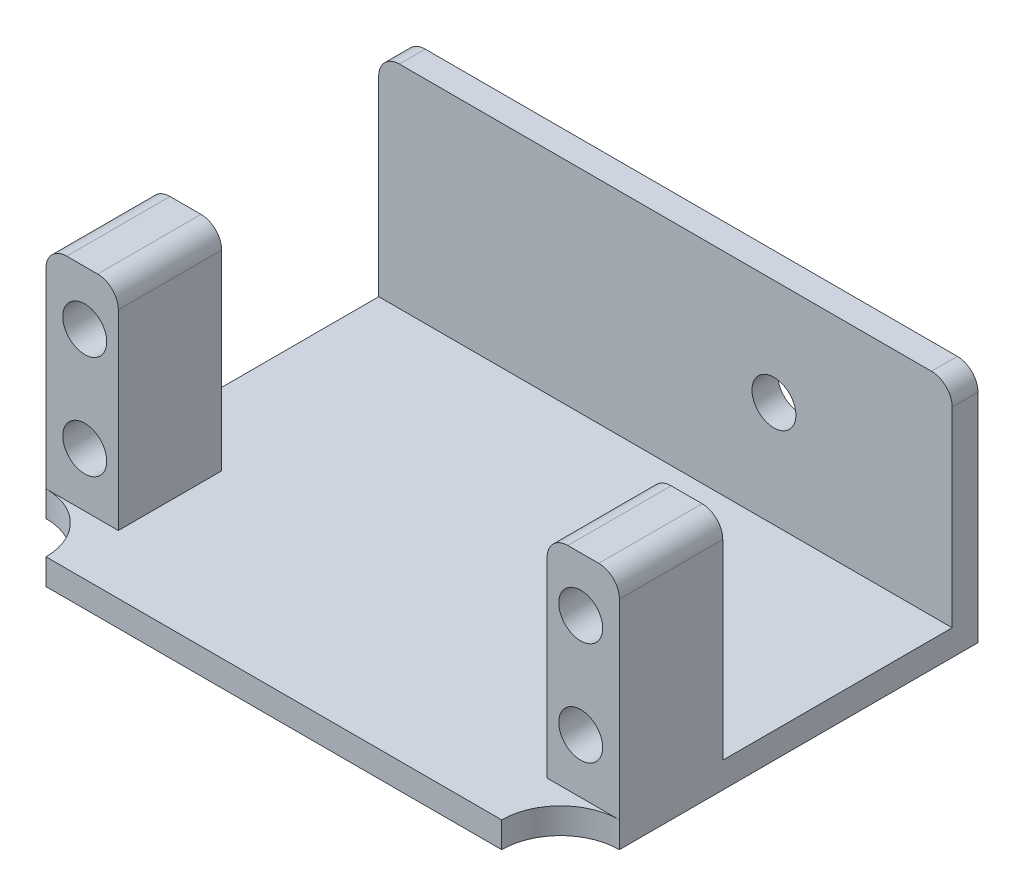
ISO-10303-21;
HEADER;
FILE_DESCRIPTION(('STEP AP214'),'2;1');
FILE_NAME('part.step','',(''),(''),'','','');
FILE_SCHEMA(('AUTOMOTIVE_DESIGN { 1 0 10303 214 1 1 1 1 }'));
ENDSEC;
DATA;
#1=APPLICATION_CONTEXT('core data for automotive mechanical design processes');
#2=APPLICATION_PROTOCOL_DEFINITION('international standard','automotive_design',2000,#1);
#3=PRODUCT_CONTEXT('',#1,'mechanical');
#4=PRODUCT('Part','Part','',(#3));
#5=PRODUCT_RELATED_PRODUCT_CATEGORY('part','',(#4));
#6=PRODUCT_DEFINITION_FORMATION('','',#4);
#7=PRODUCT_DEFINITION_CONTEXT('part definition',#1,'design');
#8=PRODUCT_DEFINITION('design','',#6,#7);
#9=PRODUCT_DEFINITION_SHAPE('','',#8);
#10=(LENGTH_UNIT() NAMED_UNIT(*) SI_UNIT(.MILLI.,.METRE.));
#11=(NAMED_UNIT(*) PLANE_ANGLE_UNIT() SI_UNIT($,.RADIAN.));
#12=(NAMED_UNIT(*) SI_UNIT($,.STERADIAN.) SOLID_ANGLE_UNIT());
#13=UNCERTAINTY_MEASURE_WITH_UNIT(LENGTH_MEASURE(1.E-05),#10,'distance_accuracy_value','');
#14=(GEOMETRIC_REPRESENTATION_CONTEXT(3) GLOBAL_UNCERTAINTY_ASSIGNED_CONTEXT((#13)) GLOBAL_UNIT_ASSIGNED_CONTEXT((#10,
#11,#12)) REPRESENTATION_CONTEXT('',''));
#15=CARTESIAN_POINT('',(0.,0.,0.));
#16=DIRECTION('',(0.,0.,1.));
#17=DIRECTION('',(1.,0.,0.));
#18=AXIS2_PLACEMENT_3D('',#15,#16,#17);
#19=CARTESIAN_POINT('',(0.,2.5,0.));
#20=DIRECTION('',(1.,0.,0.));
#21=DIRECTION('',(0.,0.,-1.));
#22=AXIS2_PLACEMENT_3D('',#19,#20,#21);
#23=PLANE('',#22);
#24=DIRECTION('',(0.,-1.,0.));
#25=VECTOR('',#24,1.);
#26=CARTESIAN_POINT('',(0.,2.5,-5.7));
#27=LINE('',#26,#25);
#28=CARTESIAN_POINT('',(0.,21.,-5.7));
#29=VERTEX_POINT('',#28);
#30=CARTESIAN_POINT('',(0.,2.5,-5.7));
#31=VERTEX_POINT('',#30);
#32=EDGE_CURVE('E362',#29,#31,#27,.T.);
#33=ORIENTED_EDGE('',*,*,#32,.F.);
#34=DIRECTION('',(0.,0.,-1.));
#35=VECTOR('',#34,1.);
#36=CARTESIAN_POINT('',(0.,21.,0.));
#37=LINE('',#36,#35);
#38=CARTESIAN_POINT('',(0.,21.,-15.7));
#39=VERTEX_POINT('',#38);
#40=EDGE_CURVE('E430',#29,#39,#37,.T.);
#41=ORIENTED_EDGE('',*,*,#40,.T.);
#42=DIRECTION('',(0.,1.,0.));
#43=VECTOR('',#42,1.);
#44=CARTESIAN_POINT('',(0.,2.5,-15.7));
#45=LINE('',#44,#43);
#46=CARTESIAN_POINT('',(0.,2.5,-15.7));
#47=VERTEX_POINT('',#46);
#48=EDGE_CURVE('E215',#47,#39,#45,.T.);
#49=ORIENTED_EDGE('',*,*,#48,.F.);
#50=DIRECTION('',(0.,0.,1.));
#51=VECTOR('',#50,1.);
#52=CARTESIAN_POINT('',(0.,2.5,0.));
#53=LINE('',#52,#51);
#54=CARTESIAN_POINT('',(0.,2.5,-37.9));
#55=VERTEX_POINT('',#54);
#56=EDGE_CURVE('E65',#55,#47,#53,.T.);
#57=ORIENTED_EDGE('',*,*,#56,.F.);
#58=DIRECTION('',(0.,-1.,0.));
#59=VECTOR('',#58,1.);
#60=CARTESIAN_POINT('',(0.,78.5562777730834,-37.9));
#61=LINE('',#60,#59);
#62=CARTESIAN_POINT('',(0.,21.,-37.9));
#63=VERTEX_POINT('',#62);
#64=EDGE_CURVE('E323',#63,#55,#61,.T.);
#65=ORIENTED_EDGE('',*,*,#64,.F.);
#66=DIRECTION('',(0.,0.,-1.));
#67=VECTOR('',#66,1.);
#68=CARTESIAN_POINT('',(0.,21.,0.));
#69=LINE('',#68,#67);
#70=CARTESIAN_POINT('',(0.,21.,-40.4));
#71=VERTEX_POINT('',#70);
#72=EDGE_CURVE('E426',#63,#71,#69,.T.);
#73=ORIENTED_EDGE('',*,*,#72,.T.);
#74=DIRECTION('',(0.,-1.,0.));
#75=VECTOR('',#74,1.);
#76=CARTESIAN_POINT('',(0.,78.5562777730834,-40.4));
#77=LINE('',#76,#75);
#78=CARTESIAN_POINT('',(0.,0.,-40.4));
#79=VERTEX_POINT('',#78);
#80=EDGE_CURVE('E313',#71,#79,#77,.T.);
#81=ORIENTED_EDGE('',*,*,#80,.T.);
#82=DIRECTION('',(0.,0.,1.));
#83=VECTOR('',#82,1.);
#84=CARTESIAN_POINT('',(0.,0.,0.));
#85=LINE('',#84,#83);
#86=CARTESIAN_POINT('',(0.,0.,-5.7));
#87=VERTEX_POINT('',#86);
#88=EDGE_CURVE('E378',#79,#87,#85,.T.);
#89=ORIENTED_EDGE('',*,*,#88,.T.);
#90=DIRECTION('',(0.,1.,0.));
#91=VECTOR('',#90,1.);
#92=CARTESIAN_POINT('',(0.,0.,-5.7));
#93=LINE('',#92,#91);
#94=EDGE_CURVE('E299',#87,#31,#93,.T.);
#95=ORIENTED_EDGE('',*,*,#94,.T.);
#96=EDGE_LOOP('',(#33,#41,#49,#57,#65,#73,#81,#89,#95));
#97=FACE_BOUND('',#96,.T.);
#98=ADVANCED_FACE('F41',(#97),#23,.F.);
#99=CARTESIAN_POINT('',(0.,2.5,0.));
#100=DIRECTION('',(0.,0.,-1.));
#101=DIRECTION('',(-1.,0.,0.));
#102=AXIS2_PLACEMENT_3D('',#99,#100,#101);
#103=PLANE('',#102);
#104=DIRECTION('',(1.,0.,0.));
#105=VECTOR('',#104,1.);
#106=CARTESIAN_POINT('',(0.,2.5,0.));
#107=LINE('',#106,#105);
#108=CARTESIAN_POINT('',(5.7,2.5,0.));
#109=VERTEX_POINT('',#108);
#110=CARTESIAN_POINT('',(49.8,2.5,0.));
#111=VERTEX_POINT('',#110);
#112=EDGE_CURVE('E381',#109,#111,#107,.T.);
#113=ORIENTED_EDGE('',*,*,#112,.F.);
#114=DIRECTION('',(0.,1.,0.));
#115=VECTOR('',#114,1.);
#116=CARTESIAN_POINT('',(5.7,0.,0.));
#117=LINE('',#116,#115);
#118=CARTESIAN_POINT('',(5.7,0.,0.));
#119=VERTEX_POINT('',#118);
#120=EDGE_CURVE('E295',#109,#119,#117,.F.);
#121=ORIENTED_EDGE('',*,*,#120,.T.);
#122=DIRECTION('',(1.,0.,0.));
#123=VECTOR('',#122,1.);
#124=CARTESIAN_POINT('',(0.,0.,0.));
#125=LINE('',#124,#123);
#126=CARTESIAN_POINT('',(49.8,0.,0.));
#127=VERTEX_POINT('',#126);
#128=EDGE_CURVE('E394',#119,#127,#125,.T.);
#129=ORIENTED_EDGE('',*,*,#128,.T.);
#130=DIRECTION('',(0.,1.,0.));
#131=VECTOR('',#130,1.);
#132=CARTESIAN_POINT('',(49.8,0.,0.));
#133=LINE('',#132,#131);
#134=EDGE_CURVE('E291',#127,#111,#133,.T.);
#135=ORIENTED_EDGE('',*,*,#134,.T.);
#136=EDGE_LOOP('',(#113,#121,#129,#135));
#137=FACE_BOUND('',#136,.T.);
#138=ADVANCED_FACE('F483',(#137),#103,.F.);
#139=CARTESIAN_POINT('',(55.5,2.5,0.));
#140=DIRECTION('',(-1.,0.,0.));
#141=DIRECTION('',(0.,0.,1.));
#142=AXIS2_PLACEMENT_3D('',#139,#140,#141);
#143=PLANE('',#142);
#144=DIRECTION('',(0.,0.,-1.));
#145=VECTOR('',#144,1.);
#146=CARTESIAN_POINT('',(55.5,2.5,0.));
#147=LINE('',#146,#145);
#148=CARTESIAN_POINT('',(55.5,2.5,-15.7));
#149=VERTEX_POINT('',#148);
#150=CARTESIAN_POINT('',(55.5,2.5,-37.9));
#151=VERTEX_POINT('',#150);
#152=EDGE_CURVE('E386',#149,#151,#147,.T.);
#153=ORIENTED_EDGE('',*,*,#152,.F.);
#154=DIRECTION('',(0.,-1.,0.));
#155=VECTOR('',#154,1.);
#156=CARTESIAN_POINT('',(55.5,21.,-15.7));
#157=LINE('',#156,#155);
#158=CARTESIAN_POINT('',(55.5,21.,-15.7));
#159=VERTEX_POINT('',#158);
#160=EDGE_CURVE('E264',#159,#149,#157,.T.);
#161=ORIENTED_EDGE('',*,*,#160,.F.);
#162=DIRECTION('',(0.,0.,-1.));
#163=VECTOR('',#162,1.);
#164=CARTESIAN_POINT('',(55.5,21.,0.));
#165=LINE('',#164,#163);
#166=CARTESIAN_POINT('',(55.5,21.,-5.7));
#167=VERTEX_POINT('',#166);
#168=EDGE_CURVE('E437',#159,#167,#165,.F.);
#169=ORIENTED_EDGE('',*,*,#168,.T.);
#170=DIRECTION('',(0.,1.,0.));
#171=VECTOR('',#170,1.);
#172=CARTESIAN_POINT('',(55.5,2.5,-5.7));
#173=LINE('',#172,#171);
#174=CARTESIAN_POINT('',(55.5,2.5,-5.7));
#175=VERTEX_POINT('',#174);
#176=EDGE_CURVE('E344',#175,#167,#173,.T.);
#177=ORIENTED_EDGE('',*,*,#176,.F.);
#178=DIRECTION('',(0.,1.,0.));
#179=VECTOR('',#178,1.);
#180=CARTESIAN_POINT('',(55.5,0.,-5.7));
#181=LINE('',#180,#179);
#182=CARTESIAN_POINT('',(55.5,0.,-5.7));
#183=VERTEX_POINT('',#182);
#184=EDGE_CURVE('E276',#175,#183,#181,.F.);
#185=ORIENTED_EDGE('',*,*,#184,.T.);
#186=DIRECTION('',(0.,0.,-1.));
#187=VECTOR('',#186,1.);
#188=CARTESIAN_POINT('',(55.5,0.,0.));
#189=LINE('',#188,#187);
#190=CARTESIAN_POINT('',(55.5,0.,-40.4));
#191=VERTEX_POINT('',#190);
#192=EDGE_CURVE('E382',#183,#191,#189,.T.);
#193=ORIENTED_EDGE('',*,*,#192,.T.);
#194=DIRECTION('',(0.,-1.,0.));
#195=VECTOR('',#194,1.);
#196=CARTESIAN_POINT('',(55.5,78.5562777730834,-40.4));
#197=LINE('',#196,#195);
#198=CARTESIAN_POINT('',(55.5,21.,-40.4));
#199=VERTEX_POINT('',#198);
#200=EDGE_CURVE('E316',#199,#191,#197,.T.);
#201=ORIENTED_EDGE('',*,*,#200,.F.);
#202=DIRECTION('',(0.,0.,1.));
#203=VECTOR('',#202,1.);
#204=CARTESIAN_POINT('',(55.5,21.,0.));
#205=LINE('',#204,#203);
#206=CARTESIAN_POINT('',(55.5,21.,-37.9));
#207=VERTEX_POINT('',#206);
#208=EDGE_CURVE('E433',#199,#207,#205,.T.);
#209=ORIENTED_EDGE('',*,*,#208,.T.);
#210=DIRECTION('',(0.,-1.,0.));
#211=VECTOR('',#210,1.);
#212=CARTESIAN_POINT('',(55.5,78.5562777730834,-37.9));
#213=LINE('',#212,#211);
#214=EDGE_CURVE('E319',#207,#151,#213,.T.);
#215=ORIENTED_EDGE('',*,*,#214,.T.);
#216=EDGE_LOOP('',(#153,#161,#169,#177,#185,#193,#201,#209,#215));
#217=FACE_BOUND('',#216,.T.);
#218=ADVANCED_FACE('F495',(#217),#143,.F.);
#219=CARTESIAN_POINT('',(0.,2.5,0.));
#220=DIRECTION('',(0.,-1.,0.));
#221=DIRECTION('',(0.,0.,-1.));
#222=AXIS2_PLACEMENT_3D('',#219,#220,#221);
#223=PLANE('',#222);
#224=ORIENTED_EDGE('',*,*,#56,.T.);
#225=DIRECTION('',(-1.,0.,0.));
#226=VECTOR('',#225,1.);
#227=CARTESIAN_POINT('',(7.,2.5,-15.7));
#228=LINE('',#227,#226);
#229=CARTESIAN_POINT('',(7.,2.5,-15.7));
#230=VERTEX_POINT('',#229);
#231=EDGE_CURVE('E231',#230,#47,#228,.T.);
#232=ORIENTED_EDGE('',*,*,#231,.F.);
#233=DIRECTION('',(0.,0.,-1.));
#234=VECTOR('',#233,1.);
#235=CARTESIAN_POINT('',(7.,2.5,-5.7));
#236=LINE('',#235,#234);
#237=CARTESIAN_POINT('',(7.,2.5,-5.7));
#238=VERTEX_POINT('',#237);
#239=EDGE_CURVE('E58',#238,#230,#236,.T.);
#240=ORIENTED_EDGE('',*,*,#239,.F.);
#241=DIRECTION('',(1.,0.,0.));
#242=VECTOR('',#241,1.);
#243=CARTESIAN_POINT('',(0.,2.5,-5.7));
#244=LINE('',#243,#242);
#245=EDGE_CURVE('E365',#31,#238,#244,.T.);
#246=ORIENTED_EDGE('',*,*,#245,.F.);
#247=CARTESIAN_POINT('',(0.,2.5,0.));
#248=DIRECTION('',(0.,1.,0.));
#249=DIRECTION('',(0.,0.,1.));
#250=AXIS2_PLACEMENT_3D('',#247,#248,#249);
#251=CIRCLE('',#250,5.7);
#252=EDGE_CURVE('E277',#109,#31,#251,.T.);
#253=ORIENTED_EDGE('',*,*,#252,.F.);
#254=ORIENTED_EDGE('',*,*,#112,.T.);
#255=CARTESIAN_POINT('',(55.5,2.5,0.));
#256=DIRECTION('',(0.,1.,0.));
#257=DIRECTION('',(0.,0.,1.));
#258=AXIS2_PLACEMENT_3D('',#255,#256,#257);
#259=CIRCLE('',#258,5.7);
#260=EDGE_CURVE('E285',#175,#111,#259,.T.);
#261=ORIENTED_EDGE('',*,*,#260,.F.);
#262=DIRECTION('',(1.,0.,0.));
#263=VECTOR('',#262,1.);
#264=CARTESIAN_POINT('',(55.5,2.5,-5.7));
#265=LINE('',#264,#263);
#266=CARTESIAN_POINT('',(48.5,2.5,-5.7));
#267=VERTEX_POINT('',#266);
#268=EDGE_CURVE('E355',#267,#175,#265,.T.);
#269=ORIENTED_EDGE('',*,*,#268,.F.);
#270=DIRECTION('',(0.,0.,-1.));
#271=VECTOR('',#270,1.);
#272=CARTESIAN_POINT('',(48.5,2.5,-5.7));
#273=LINE('',#272,#271);
#274=CARTESIAN_POINT('',(48.5,2.5,-15.7));
#275=VERTEX_POINT('',#274);
#276=EDGE_CURVE('E359',#267,#275,#273,.T.);
#277=ORIENTED_EDGE('',*,*,#276,.T.);
#278=DIRECTION('',(-1.,0.,0.));
#279=VECTOR('',#278,1.);
#280=CARTESIAN_POINT('',(55.5,2.5,-15.7));
#281=LINE('',#280,#279);
#282=EDGE_CURVE('E244',#149,#275,#281,.T.);
#283=ORIENTED_EDGE('',*,*,#282,.F.);
#284=ORIENTED_EDGE('',*,*,#152,.T.);
#285=DIRECTION('',(-1.,0.,0.));
#286=VECTOR('',#285,1.);
#287=CARTESIAN_POINT('',(0.,2.5,-37.9));
#288=LINE('',#287,#286);
#289=EDGE_CURVE('E199',#151,#55,#288,.T.);
#290=ORIENTED_EDGE('',*,*,#289,.T.);
#291=EDGE_LOOP('',(#224,#232,#240,#246,#253,#254,#261,#269,#277,#283,#284,#290));
#292=FACE_BOUND('',#291,.T.);
#293=ADVANCED_FACE('F480',(#292),#223,.F.);
#294=CARTESIAN_POINT('',(0.,0.,0.));
#295=DIRECTION('',(0.,-1.,0.));
#296=DIRECTION('',(0.,0.,-1.));
#297=AXIS2_PLACEMENT_3D('',#294,#295,#296);
#298=PLANE('',#297);
#299=CARTESIAN_POINT('',(0.,0.,0.));
#300=DIRECTION('',(0.,1.,0.));
#301=DIRECTION('',(0.,0.,1.));
#302=AXIS2_PLACEMENT_3D('',#299,#300,#301);
#303=CIRCLE('',#302,5.7);
#304=EDGE_CURVE('E272',#119,#87,#303,.T.);
#305=ORIENTED_EDGE('',*,*,#304,.T.);
#306=ORIENTED_EDGE('',*,*,#88,.F.);
#307=DIRECTION('',(-1.,0.,0.));
#308=VECTOR('',#307,1.);
#309=CARTESIAN_POINT('',(0.,0.,-40.4));
#310=LINE('',#309,#308);
#311=EDGE_CURVE('E303',#191,#79,#310,.T.);
#312=ORIENTED_EDGE('',*,*,#311,.F.);
#313=ORIENTED_EDGE('',*,*,#192,.F.);
#314=CARTESIAN_POINT('',(55.5,0.,0.));
#315=DIRECTION('',(0.,1.,0.));
#316=DIRECTION('',(0.,0.,1.));
#317=AXIS2_PLACEMENT_3D('',#314,#315,#316);
#318=CIRCLE('',#317,5.7);
#319=EDGE_CURVE('E281',#183,#127,#318,.T.);
#320=ORIENTED_EDGE('',*,*,#319,.T.);
#321=ORIENTED_EDGE('',*,*,#128,.F.);
#322=EDGE_LOOP('',(#305,#306,#312,#313,#320,#321));
#323=FACE_BOUND('',#322,.T.);
#324=ADVANCED_FACE('F489',(#323),#298,.T.);
#325=CARTESIAN_POINT('',(7.,2.5,-5.7));
#326=DIRECTION('',(-1.,0.,0.));
#327=DIRECTION('',(0.,0.,1.));
#328=AXIS2_PLACEMENT_3D('',#325,#326,#327);
#329=PLANE('',#328);
#330=ORIENTED_EDGE('',*,*,#239,.T.);
#331=DIRECTION('',(0.,-1.,0.));
#332=VECTOR('',#331,1.);
#333=CARTESIAN_POINT('',(7.,21.,-15.7));
#334=LINE('',#333,#332);
#335=CARTESIAN_POINT('',(7.,21.,-15.7));
#336=VERTEX_POINT('',#335);
#337=EDGE_CURVE('E227',#336,#230,#334,.T.);
#338=ORIENTED_EDGE('',*,*,#337,.F.);
#339=DIRECTION('',(0.,0.,-1.));
#340=VECTOR('',#339,1.);
#341=CARTESIAN_POINT('',(7.,21.,-5.7));
#342=LINE('',#341,#340);
#343=CARTESIAN_POINT('',(7.,21.,-5.7));
#344=VERTEX_POINT('',#343);
#345=EDGE_CURVE('E403',#336,#344,#342,.F.);
#346=ORIENTED_EDGE('',*,*,#345,.T.);
#347=DIRECTION('',(0.,1.,0.));
#348=VECTOR('',#347,1.);
#349=CARTESIAN_POINT('',(7.,2.5,-5.7));
#350=LINE('',#349,#348);
#351=EDGE_CURVE('E369',#238,#344,#350,.T.);
#352=ORIENTED_EDGE('',*,*,#351,.F.);
#353=EDGE_LOOP('',(#330,#338,#346,#352));
#354=FACE_BOUND('',#353,.T.);
#355=ADVANCED_FACE('F624',(#354),#329,.F.);
#356=CARTESIAN_POINT('',(0.,23.,-5.7));
#357=DIRECTION('',(0.,-1.,0.));
#358=DIRECTION('',(0.,0.,-1.));
#359=AXIS2_PLACEMENT_3D('',#356,#357,#358);
#360=PLANE('',#359);
#361=DIRECTION('',(-1.,0.,0.));
#362=VECTOR('',#361,1.);
#363=CARTESIAN_POINT('',(0.,23.,-5.7));
#364=LINE('',#363,#362);
#365=CARTESIAN_POINT('',(5.,23.,-5.7));
#366=VERTEX_POINT('',#365);
#367=CARTESIAN_POINT('',(2.,23.,-5.7));
#368=VERTEX_POINT('',#367);
#369=EDGE_CURVE('E373',#366,#368,#364,.T.);
#370=ORIENTED_EDGE('',*,*,#369,.F.);
#371=DIRECTION('',(0.,0.,-1.));
#372=VECTOR('',#371,1.);
#373=CARTESIAN_POINT('',(5.,23.,-5.7));
#374=LINE('',#373,#372);
#375=CARTESIAN_POINT('',(5.,23.,-15.7));
#376=VERTEX_POINT('',#375);
#377=EDGE_CURVE('E198',#366,#376,#374,.T.);
#378=ORIENTED_EDGE('',*,*,#377,.T.);
#379=DIRECTION('',(1.,0.,0.));
#380=VECTOR('',#379,1.);
#381=CARTESIAN_POINT('',(2.,23.,-15.7));
#382=LINE('',#381,#380);
#383=CARTESIAN_POINT('',(2.,23.,-15.7));
#384=VERTEX_POINT('',#383);
#385=EDGE_CURVE('E202',#384,#376,#382,.T.);
#386=ORIENTED_EDGE('',*,*,#385,.F.);
#387=DIRECTION('',(0.,0.,-1.));
#388=VECTOR('',#387,1.);
#389=CARTESIAN_POINT('',(2.,23.,-5.7));
#390=LINE('',#389,#388);
#391=EDGE_CURVE('E187',#384,#368,#390,.F.);
#392=ORIENTED_EDGE('',*,*,#391,.T.);
#393=EDGE_LOOP('',(#370,#378,#386,#392));
#394=FACE_BOUND('',#393,.T.);
#395=ADVANCED_FACE('F203',(#394),#360,.F.);
#396=CARTESIAN_POINT('',(0.,0.,-5.7));
#397=DIRECTION('',(0.,0.,-1.));
#398=DIRECTION('',(-1.,0.,0.));
#399=AXIS2_PLACEMENT_3D('',#396,#397,#398);
#400=PLANE('',#399);
#401=CARTESIAN_POINT('',(3.75,7.75,-5.7));
#402=DIRECTION('',(0.,0.,1.));
#403=DIRECTION('',(-1.,0.,0.));
#404=AXIS2_PLACEMENT_3D('',#401,#402,#403);
#405=CIRCLE('',#404,2.125);
#406=CARTESIAN_POINT('',(1.625,7.75,-5.7));
#407=VERTEX_POINT('',#406);
#408=EDGE_CURVE('E329',#407,#407,#405,.T.);
#409=ORIENTED_EDGE('',*,*,#408,.F.);
#410=EDGE_LOOP('',(#409));
#411=FACE_BOUND('',#410,.T.);
#412=CARTESIAN_POINT('',(3.75,17.75,-5.7));
#413=DIRECTION('',(0.,0.,1.));
#414=DIRECTION('',(1.,0.,0.));
#415=AXIS2_PLACEMENT_3D('',#412,#413,#414);
#416=CIRCLE('',#415,2.125);
#417=CARTESIAN_POINT('',(5.875,17.75,-5.7));
#418=VERTEX_POINT('',#417);
#419=EDGE_CURVE('E333',#418,#418,#416,.T.);
#420=ORIENTED_EDGE('',*,*,#419,.F.);
#421=EDGE_LOOP('',(#420));
#422=FACE_BOUND('',#421,.T.);
#423=ORIENTED_EDGE('',*,*,#351,.T.);
#424=CARTESIAN_POINT('',(5.,21.,-5.7));
#425=DIRECTION('',(0.,0.,-1.));
#426=DIRECTION('',(-1.,0.,0.));
#427=AXIS2_PLACEMENT_3D('',#424,#425,#426);
#428=CIRCLE('',#427,2.);
#429=EDGE_CURVE('E408',#344,#366,#428,.F.);
#430=ORIENTED_EDGE('',*,*,#429,.T.);
#431=ORIENTED_EDGE('',*,*,#369,.T.);
#432=CARTESIAN_POINT('',(2.,21.,-5.7));
#433=DIRECTION('',(0.,0.,-1.));
#434=DIRECTION('',(-1.,0.,0.));
#435=AXIS2_PLACEMENT_3D('',#432,#433,#434);
#436=CIRCLE('',#435,2.);
#437=EDGE_CURVE('E193',#368,#29,#436,.F.);
#438=ORIENTED_EDGE('',*,*,#437,.T.);
#439=ORIENTED_EDGE('',*,*,#32,.T.);
#440=ORIENTED_EDGE('',*,*,#245,.T.);
#441=EDGE_LOOP('',(#423,#430,#431,#438,#439,#440));
#442=FACE_BOUND('',#441,.T.);
#443=ADVANCED_FACE('F475',(#411,#422,#442),#400,.F.);
#444=CARTESIAN_POINT('',(55.5,23.,-5.7));
#445=DIRECTION('',(0.,-1.,0.));
#446=DIRECTION('',(0.,0.,-1.));
#447=AXIS2_PLACEMENT_3D('',#444,#445,#446);
#448=PLANE('',#447);
#449=DIRECTION('',(0.,0.,-1.));
#450=VECTOR('',#449,1.);
#451=CARTESIAN_POINT('',(53.5,23.,-5.7));
#452=LINE('',#451,#450);
#453=CARTESIAN_POINT('',(53.5,23.,-5.7));
#454=VERTEX_POINT('',#453);
#455=CARTESIAN_POINT('',(53.5,23.,-15.7));
#456=VERTEX_POINT('',#455);
#457=EDGE_CURVE('E414',#454,#456,#452,.T.);
#458=ORIENTED_EDGE('',*,*,#457,.T.);
#459=DIRECTION('',(1.,0.,0.));
#460=VECTOR('',#459,1.);
#461=CARTESIAN_POINT('',(50.5,23.,-15.7));
#462=LINE('',#461,#460);
#463=CARTESIAN_POINT('',(50.5,23.,-15.7));
#464=VERTEX_POINT('',#463);
#465=EDGE_CURVE('E256',#464,#456,#462,.T.);
#466=ORIENTED_EDGE('',*,*,#465,.F.);
#467=DIRECTION('',(0.,0.,-1.));
#468=VECTOR('',#467,1.);
#469=CARTESIAN_POINT('',(50.5,23.,-5.7));
#470=LINE('',#469,#468);
#471=CARTESIAN_POINT('',(50.5,23.,-5.7));
#472=VERTEX_POINT('',#471);
#473=EDGE_CURVE('E417',#464,#472,#470,.F.);
#474=ORIENTED_EDGE('',*,*,#473,.T.);
#475=DIRECTION('',(-1.,0.,0.));
#476=VECTOR('',#475,1.);
#477=CARTESIAN_POINT('',(55.5,23.,-5.7));
#478=LINE('',#477,#476);
#479=EDGE_CURVE('E348',#454,#472,#478,.T.);
#480=ORIENTED_EDGE('',*,*,#479,.F.);
#481=EDGE_LOOP('',(#458,#466,#474,#480));
#482=FACE_BOUND('',#481,.T.);
#483=ADVANCED_FACE('F518',(#482),#448,.F.);
#484=CARTESIAN_POINT('',(48.5,2.5,-5.7));
#485=DIRECTION('',(1.,0.,0.));
#486=DIRECTION('',(0.,0.,-1.));
#487=AXIS2_PLACEMENT_3D('',#484,#485,#486);
#488=PLANE('',#487);
#489=DIRECTION('',(0.,-1.,0.));
#490=VECTOR('',#489,1.);
#491=CARTESIAN_POINT('',(48.5,2.5,-5.7));
#492=LINE('',#491,#490);
#493=CARTESIAN_POINT('',(48.5,21.,-5.7));
#494=VERTEX_POINT('',#493);
#495=EDGE_CURVE('E352',#494,#267,#492,.T.);
#496=ORIENTED_EDGE('',*,*,#495,.F.);
#497=DIRECTION('',(0.,0.,-1.));
#498=VECTOR('',#497,1.);
#499=CARTESIAN_POINT('',(48.5,21.,-5.7));
#500=LINE('',#499,#498);
#501=CARTESIAN_POINT('',(48.5,21.,-15.7));
#502=VERTEX_POINT('',#501);
#503=EDGE_CURVE('E411',#494,#502,#500,.T.);
#504=ORIENTED_EDGE('',*,*,#503,.T.);
#505=DIRECTION('',(0.,1.,0.));
#506=VECTOR('',#505,1.);
#507=CARTESIAN_POINT('',(48.5,2.5,-15.7));
#508=LINE('',#507,#506);
#509=EDGE_CURVE('E248',#275,#502,#508,.T.);
#510=ORIENTED_EDGE('',*,*,#509,.F.);
#511=ORIENTED_EDGE('',*,*,#276,.F.);
#512=EDGE_LOOP('',(#496,#504,#510,#511));
#513=FACE_BOUND('',#512,.T.);
#514=ADVANCED_FACE('F507',(#513),#488,.F.);
#515=CARTESIAN_POINT('',(0.,0.,-5.7));
#516=DIRECTION('',(0.,0.,1.));
#517=DIRECTION('',(1.,0.,0.));
#518=AXIS2_PLACEMENT_3D('',#515,#516,#517);
#519=PLANE('',#518);
#520=CARTESIAN_POINT('',(51.75,17.75,-5.7));
#521=DIRECTION('',(0.,0.,1.));
#522=DIRECTION('',(-1.,0.,0.));
#523=AXIS2_PLACEMENT_3D('',#520,#521,#522);
#524=CIRCLE('',#523,2.125);
#525=CARTESIAN_POINT('',(49.625,17.75,-5.7));
#526=VERTEX_POINT('',#525);
#527=EDGE_CURVE('E308',#526,#526,#524,.T.);
#528=ORIENTED_EDGE('',*,*,#527,.F.);
#529=EDGE_LOOP('',(#528));
#530=FACE_BOUND('',#529,.T.);
#531=CARTESIAN_POINT('',(51.75,7.75,-5.7));
#532=DIRECTION('',(0.,0.,1.));
#533=DIRECTION('',(1.,0.,0.));
#534=AXIS2_PLACEMENT_3D('',#531,#532,#533);
#535=CIRCLE('',#534,2.125);
#536=CARTESIAN_POINT('',(53.875,7.75,-5.7));
#537=VERTEX_POINT('',#536);
#538=EDGE_CURVE('E334',#537,#537,#535,.T.);
#539=ORIENTED_EDGE('',*,*,#538,.F.);
#540=EDGE_LOOP('',(#539));
#541=FACE_BOUND('',#540,.T.);
#542=ORIENTED_EDGE('',*,*,#479,.T.);
#543=CARTESIAN_POINT('',(50.5,21.,-5.7));
#544=DIRECTION('',(0.,0.,1.));
#545=DIRECTION('',(1.,0.,0.));
#546=AXIS2_PLACEMENT_3D('',#543,#544,#545);
#547=CIRCLE('',#546,2.);
#548=EDGE_CURVE('E423',#472,#494,#547,.T.);
#549=ORIENTED_EDGE('',*,*,#548,.T.);
#550=ORIENTED_EDGE('',*,*,#495,.T.);
#551=ORIENTED_EDGE('',*,*,#268,.T.);
#552=ORIENTED_EDGE('',*,*,#176,.T.);
#553=CARTESIAN_POINT('',(53.5,21.,-5.7));
#554=DIRECTION('',(0.,0.,1.));
#555=DIRECTION('',(1.,0.,0.));
#556=AXIS2_PLACEMENT_3D('',#553,#554,#555);
#557=CIRCLE('',#556,2.);
#558=EDGE_CURVE('E420',#167,#454,#557,.T.);
#559=ORIENTED_EDGE('',*,*,#558,.T.);
#560=EDGE_LOOP('',(#542,#549,#550,#551,#552,#559));
#561=FACE_BOUND('',#560,.T.);
#562=ADVANCED_FACE('F501',(#530,#541,#561),#519,.T.);
#563=CARTESIAN_POINT('',(51.75,7.75,-8.2));
#564=DIRECTION('',(0.,0.,1.));
#565=DIRECTION('',(1.,0.,0.));
#566=AXIS2_PLACEMENT_3D('',#563,#564,#565);
#567=CYLINDRICAL_SURFACE('',#566,2.125);
#568=ORIENTED_EDGE('',*,*,#538,.T.);
#569=EDGE_LOOP('',(#568));
#570=FACE_BOUND('',#569,.T.);
#571=CARTESIAN_POINT('',(51.75,7.75,-15.7));
#572=DIRECTION('',(0.,0.,-1.));
#573=DIRECTION('',(-1.,0.,0.));
#574=AXIS2_PLACEMENT_3D('',#571,#572,#573);
#575=CIRCLE('',#574,2.125);
#576=CARTESIAN_POINT('',(49.625,7.75,-15.7));
#577=VERTEX_POINT('',#576);
#578=EDGE_CURVE('E236',#577,#577,#575,.T.);
#579=ORIENTED_EDGE('',*,*,#578,.T.);
#580=EDGE_LOOP('',(#579));
#581=FACE_BOUND('',#580,.T.);
#582=ADVANCED_FACE('F601',(#570,#581),#567,.F.);
#583=CARTESIAN_POINT('',(51.75,17.75,-8.2));
#584=DIRECTION('',(0.,0.,1.));
#585=DIRECTION('',(1.,0.,0.));
#586=AXIS2_PLACEMENT_3D('',#583,#584,#585);
#587=CYLINDRICAL_SURFACE('',#586,2.125);
#588=ORIENTED_EDGE('',*,*,#527,.T.);
#589=EDGE_LOOP('',(#588));
#590=FACE_BOUND('',#589,.T.);
#591=CARTESIAN_POINT('',(51.75,17.75,-15.7));
#592=DIRECTION('',(0.,0.,-1.));
#593=DIRECTION('',(-1.,0.,0.));
#594=AXIS2_PLACEMENT_3D('',#591,#592,#593);
#595=CIRCLE('',#594,2.125);
#596=CARTESIAN_POINT('',(49.625,17.75,-15.7));
#597=VERTEX_POINT('',#596);
#598=EDGE_CURVE('E240',#597,#597,#595,.T.);
#599=ORIENTED_EDGE('',*,*,#598,.T.);
#600=EDGE_LOOP('',(#599));
#601=FACE_BOUND('',#600,.T.);
#602=ADVANCED_FACE('F604',(#590,#601),#587,.F.);
#603=CARTESIAN_POINT('',(3.75,17.75,-8.2));
#604=DIRECTION('',(0.,0.,1.));
#605=DIRECTION('',(1.,0.,0.));
#606=AXIS2_PLACEMENT_3D('',#603,#604,#605);
#607=CYLINDRICAL_SURFACE('',#606,2.125);
#608=ORIENTED_EDGE('',*,*,#419,.T.);
#609=EDGE_LOOP('',(#608));
#610=FACE_BOUND('',#609,.T.);
#611=CARTESIAN_POINT('',(3.75,17.75,-15.7));
#612=DIRECTION('',(0.,0.,-1.));
#613=DIRECTION('',(-1.,0.,0.));
#614=AXIS2_PLACEMENT_3D('',#611,#612,#613);
#615=CIRCLE('',#614,2.125);
#616=CARTESIAN_POINT('',(1.625,17.75,-15.7));
#617=VERTEX_POINT('',#616);
#618=EDGE_CURVE('E217',#617,#617,#615,.T.);
#619=ORIENTED_EDGE('',*,*,#618,.T.);
#620=EDGE_LOOP('',(#619));
#621=FACE_BOUND('',#620,.T.);
#622=ADVANCED_FACE('F599',(#610,#621),#607,.F.);
#623=CARTESIAN_POINT('',(3.75,7.75,-8.2));
#624=DIRECTION('',(0.,0.,1.));
#625=DIRECTION('',(1.,0.,0.));
#626=AXIS2_PLACEMENT_3D('',#623,#624,#625);
#627=CYLINDRICAL_SURFACE('',#626,2.125);
#628=ORIENTED_EDGE('',*,*,#408,.T.);
#629=EDGE_LOOP('',(#628));
#630=FACE_BOUND('',#629,.T.);
#631=CARTESIAN_POINT('',(3.75,7.75,-15.7));
#632=DIRECTION('',(0.,0.,-1.));
#633=DIRECTION('',(-1.,0.,0.));
#634=AXIS2_PLACEMENT_3D('',#631,#632,#633);
#635=CIRCLE('',#634,2.125);
#636=CARTESIAN_POINT('',(1.625,7.75,-15.7));
#637=VERTEX_POINT('',#636);
#638=EDGE_CURVE('E221',#637,#637,#635,.T.);
#639=ORIENTED_EDGE('',*,*,#638,.T.);
#640=EDGE_LOOP('',(#639));
#641=FACE_BOUND('',#640,.T.);
#642=ADVANCED_FACE('F592',(#630,#641),#627,.F.);
#643=CARTESIAN_POINT('',(0.,78.5562777730834,-40.4));
#644=DIRECTION('',(0.,0.,1.));
#645=DIRECTION('',(1.,0.,0.));
#646=AXIS2_PLACEMENT_3D('',#643,#644,#645);
#647=PLANE('',#646);
#648=CARTESIAN_POINT('',(38.25,12.75,-40.4));
#649=DIRECTION('',(0.,0.,-1.));
#650=DIRECTION('',(1.,0.,0.));
#651=AXIS2_PLACEMENT_3D('',#648,#649,#650);
#652=CIRCLE('',#651,2.125);
#653=CARTESIAN_POINT('',(40.375,12.75,-40.4));
#654=VERTEX_POINT('',#653);
#655=EDGE_CURVE('E268',#654,#654,#652,.T.);
#656=ORIENTED_EDGE('',*,*,#655,.F.);
#657=EDGE_LOOP('',(#656));
#658=FACE_BOUND('',#657,.T.);
#659=DIRECTION('',(1.,0.,0.));
#660=VECTOR('',#659,1.);
#661=CARTESIAN_POINT('',(0.,23.,-40.4));
#662=LINE('',#661,#660);
#663=CARTESIAN_POINT('',(2.,23.,-40.4));
#664=VERTEX_POINT('',#663);
#665=CARTESIAN_POINT('',(53.5,23.,-40.4));
#666=VERTEX_POINT('',#665);
#667=EDGE_CURVE('E309',#664,#666,#662,.T.);
#668=ORIENTED_EDGE('',*,*,#667,.T.);
#669=CARTESIAN_POINT('',(53.5,21.,-40.4));
#670=DIRECTION('',(0.,0.,1.));
#671=DIRECTION('',(1.,0.,0.));
#672=AXIS2_PLACEMENT_3D('',#669,#670,#671);
#673=CIRCLE('',#672,2.);
#674=EDGE_CURVE('E11',#666,#199,#673,.F.);
#675=ORIENTED_EDGE('',*,*,#674,.T.);
#676=ORIENTED_EDGE('',*,*,#200,.T.);
#677=ORIENTED_EDGE('',*,*,#311,.T.);
#678=ORIENTED_EDGE('',*,*,#80,.F.);
#679=CARTESIAN_POINT('',(2.,21.,-40.4));
#680=DIRECTION('',(0.,0.,1.));
#681=DIRECTION('',(1.,0.,0.));
#682=AXIS2_PLACEMENT_3D('',#679,#680,#681);
#683=CIRCLE('',#682,2.);
#684=EDGE_CURVE('E51',#71,#664,#683,.F.);
#685=ORIENTED_EDGE('',*,*,#684,.T.);
#686=EDGE_LOOP('',(#668,#675,#676,#677,#678,#685));
#687=FACE_BOUND('',#686,.T.);
#688=ADVANCED_FACE('F456',(#658,#687),#647,.F.);
#689=CARTESIAN_POINT('',(0.,78.5562777730834,-37.9));
#690=DIRECTION('',(0.,0.,-1.));
#691=DIRECTION('',(-1.,0.,0.));
#692=AXIS2_PLACEMENT_3D('',#689,#690,#691);
#693=PLANE('',#692);
#694=CARTESIAN_POINT('',(38.25,12.75,-37.9));
#695=DIRECTION('',(0.,0.,-1.));
#696=DIRECTION('',(-1.,0.,0.));
#697=AXIS2_PLACEMENT_3D('',#694,#695,#696);
#698=CIRCLE('',#697,2.125);
#699=CARTESIAN_POINT('',(36.125,12.75,-37.9));
#700=VERTEX_POINT('',#699);
#701=EDGE_CURVE('E45',#700,#700,#698,.T.);
#702=ORIENTED_EDGE('',*,*,#701,.T.);
#703=EDGE_LOOP('',(#702));
#704=FACE_BOUND('',#703,.T.);
#705=ORIENTED_EDGE('',*,*,#214,.F.);
#706=CARTESIAN_POINT('',(53.5,21.,-37.9));
#707=DIRECTION('',(0.,0.,-1.));
#708=DIRECTION('',(-1.,0.,0.));
#709=AXIS2_PLACEMENT_3D('',#706,#707,#708);
#710=CIRCLE('',#709,2.);
#711=CARTESIAN_POINT('',(53.5,23.,-37.9));
#712=VERTEX_POINT('',#711);
#713=EDGE_CURVE('E443',#207,#712,#710,.F.);
#714=ORIENTED_EDGE('',*,*,#713,.T.);
#715=DIRECTION('',(-1.,0.,0.));
#716=VECTOR('',#715,1.);
#717=CARTESIAN_POINT('',(0.,23.,-37.9));
#718=LINE('',#717,#716);
#719=CARTESIAN_POINT('',(2.,23.,-37.9));
#720=VERTEX_POINT('',#719);
#721=EDGE_CURVE('E304',#712,#720,#718,.T.);
#722=ORIENTED_EDGE('',*,*,#721,.T.);
#723=CARTESIAN_POINT('',(2.,21.,-37.9));
#724=DIRECTION('',(0.,0.,-1.));
#725=DIRECTION('',(-1.,0.,0.));
#726=AXIS2_PLACEMENT_3D('',#723,#724,#725);
#727=CIRCLE('',#726,2.);
#728=EDGE_CURVE('E440',#720,#63,#727,.F.);
#729=ORIENTED_EDGE('',*,*,#728,.T.);
#730=ORIENTED_EDGE('',*,*,#64,.T.);
#731=ORIENTED_EDGE('',*,*,#289,.F.);
#732=EDGE_LOOP('',(#705,#714,#722,#729,#730,#731));
#733=FACE_BOUND('',#732,.T.);
#734=ADVANCED_FACE('F469',(#704,#733),#693,.F.);
#735=CARTESIAN_POINT('',(0.,23.,-5.7));
#736=DIRECTION('',(0.,-1.,0.));
#737=DIRECTION('',(0.,0.,-1.));
#738=AXIS2_PLACEMENT_3D('',#735,#736,#737);
#739=PLANE('',#738);
#740=ORIENTED_EDGE('',*,*,#721,.F.);
#741=DIRECTION('',(0.,0.,1.));
#742=VECTOR('',#741,1.);
#743=CARTESIAN_POINT('',(53.5,23.,-5.7));
#744=LINE('',#743,#742);
#745=EDGE_CURVE('E449',#712,#666,#744,.F.);
#746=ORIENTED_EDGE('',*,*,#745,.T.);
#747=ORIENTED_EDGE('',*,*,#667,.F.);
#748=DIRECTION('',(0.,0.,-1.));
#749=VECTOR('',#748,1.);
#750=CARTESIAN_POINT('',(2.,23.,-5.7));
#751=LINE('',#750,#749);
#752=EDGE_CURVE('E446',#664,#720,#751,.F.);
#753=ORIENTED_EDGE('',*,*,#752,.T.);
#754=EDGE_LOOP('',(#740,#746,#747,#753));
#755=FACE_BOUND('',#754,.T.);
#756=ADVANCED_FACE('F463',(#755),#739,.F.);
#757=CARTESIAN_POINT('',(55.5,0.,0.));
#758=DIRECTION('',(0.,1.,0.));
#759=DIRECTION('',(0.,0.,1.));
#760=AXIS2_PLACEMENT_3D('',#757,#758,#759);
#761=CYLINDRICAL_SURFACE('',#760,5.7);
#762=ORIENTED_EDGE('',*,*,#319,.F.);
#763=ORIENTED_EDGE('',*,*,#184,.F.);
#764=ORIENTED_EDGE('',*,*,#260,.T.);
#765=ORIENTED_EDGE('',*,*,#134,.F.);
#766=EDGE_LOOP('',(#762,#763,#764,#765));
#767=FACE_BOUND('',#766,.T.);
#768=ADVANCED_FACE('F486',(#767),#761,.F.);
#769=CARTESIAN_POINT('',(0.,0.,0.));
#770=DIRECTION('',(0.,1.,0.));
#771=DIRECTION('',(0.,0.,1.));
#772=AXIS2_PLACEMENT_3D('',#769,#770,#771);
#773=CYLINDRICAL_SURFACE('',#772,5.7);
#774=ORIENTED_EDGE('',*,*,#304,.F.);
#775=ORIENTED_EDGE('',*,*,#120,.F.);
#776=ORIENTED_EDGE('',*,*,#252,.T.);
#777=ORIENTED_EDGE('',*,*,#94,.F.);
#778=EDGE_LOOP('',(#774,#775,#776,#777));
#779=FACE_BOUND('',#778,.T.);
#780=ADVANCED_FACE('F478',(#779),#773,.F.);
#781=CARTESIAN_POINT('',(5.,21.,-5.7));
#782=DIRECTION('',(0.,0.,-1.));
#783=DIRECTION('',(-1.,0.,0.));
#784=AXIS2_PLACEMENT_3D('',#781,#782,#783);
#785=CYLINDRICAL_SURFACE('',#784,2.);
#786=ORIENTED_EDGE('',*,*,#429,.F.);
#787=ORIENTED_EDGE('',*,*,#345,.F.);
#788=CARTESIAN_POINT('',(5.,21.,-15.7));
#789=DIRECTION('',(0.,0.,-1.));
#790=DIRECTION('',(-1.,0.,0.));
#791=AXIS2_PLACEMENT_3D('',#788,#789,#790);
#792=CIRCLE('',#791,2.);
#793=EDGE_CURVE('E209',#376,#336,#792,.T.);
#794=ORIENTED_EDGE('',*,*,#793,.F.);
#795=ORIENTED_EDGE('',*,*,#377,.F.);
#796=EDGE_LOOP('',(#786,#787,#794,#795));
#797=FACE_BOUND('',#796,.T.);
#798=ADVANCED_FACE('F541',(#797),#785,.T.);
#799=CARTESIAN_POINT('',(50.5,21.,-5.7));
#800=DIRECTION('',(0.,0.,-1.));
#801=DIRECTION('',(-1.,0.,0.));
#802=AXIS2_PLACEMENT_3D('',#799,#800,#801);
#803=CYLINDRICAL_SURFACE('',#802,2.);
#804=ORIENTED_EDGE('',*,*,#548,.F.);
#805=ORIENTED_EDGE('',*,*,#473,.F.);
#806=CARTESIAN_POINT('',(50.5,21.,-15.7));
#807=DIRECTION('',(0.,0.,-1.));
#808=DIRECTION('',(-1.,0.,0.));
#809=AXIS2_PLACEMENT_3D('',#806,#807,#808);
#810=CIRCLE('',#809,2.);
#811=EDGE_CURVE('E252',#502,#464,#810,.T.);
#812=ORIENTED_EDGE('',*,*,#811,.F.);
#813=ORIENTED_EDGE('',*,*,#503,.F.);
#814=EDGE_LOOP('',(#804,#805,#812,#813));
#815=FACE_BOUND('',#814,.T.);
#816=ADVANCED_FACE('F511',(#815),#803,.T.);
#817=CARTESIAN_POINT('',(2.,21.,0.));
#818=DIRECTION('',(0.,0.,-1.));
#819=DIRECTION('',(-1.,0.,0.));
#820=AXIS2_PLACEMENT_3D('',#817,#818,#819);
#821=CYLINDRICAL_SURFACE('',#820,2.);
#822=ORIENTED_EDGE('',*,*,#437,.F.);
#823=ORIENTED_EDGE('',*,*,#391,.F.);
#824=CARTESIAN_POINT('',(2.,21.,-15.7));
#825=DIRECTION('',(0.,0.,-1.));
#826=DIRECTION('',(-1.,0.,0.));
#827=AXIS2_PLACEMENT_3D('',#824,#825,#826);
#828=CIRCLE('',#827,2.);
#829=EDGE_CURVE('E192',#39,#384,#828,.T.);
#830=ORIENTED_EDGE('',*,*,#829,.F.);
#831=ORIENTED_EDGE('',*,*,#40,.F.);
#832=EDGE_LOOP('',(#822,#823,#830,#831));
#833=FACE_BOUND('',#832,.T.);
#834=ADVANCED_FACE('F189',(#833),#821,.T.);
#835=CARTESIAN_POINT('',(53.5,21.,-5.7));
#836=DIRECTION('',(0.,0.,-1.));
#837=DIRECTION('',(-1.,0.,0.));
#838=AXIS2_PLACEMENT_3D('',#835,#836,#837);
#839=CYLINDRICAL_SURFACE('',#838,2.);
#840=ORIENTED_EDGE('',*,*,#558,.F.);
#841=ORIENTED_EDGE('',*,*,#168,.F.);
#842=CARTESIAN_POINT('',(53.5,21.,-15.7));
#843=DIRECTION('',(0.,0.,-1.));
#844=DIRECTION('',(-1.,0.,0.));
#845=AXIS2_PLACEMENT_3D('',#842,#843,#844);
#846=CIRCLE('',#845,2.);
#847=EDGE_CURVE('E260',#456,#159,#846,.T.);
#848=ORIENTED_EDGE('',*,*,#847,.F.);
#849=ORIENTED_EDGE('',*,*,#457,.F.);
#850=EDGE_LOOP('',(#840,#841,#848,#849));
#851=FACE_BOUND('',#850,.T.);
#852=ADVANCED_FACE('F522',(#851),#839,.T.);
#853=CARTESIAN_POINT('',(53.5,21.,0.));
#854=DIRECTION('',(0.,0.,1.));
#855=DIRECTION('',(1.,0.,0.));
#856=AXIS2_PLACEMENT_3D('',#853,#854,#855);
#857=CYLINDRICAL_SURFACE('',#856,2.);
#858=ORIENTED_EDGE('',*,*,#674,.F.);
#859=ORIENTED_EDGE('',*,*,#745,.F.);
#860=ORIENTED_EDGE('',*,*,#713,.F.);
#861=ORIENTED_EDGE('',*,*,#208,.F.);
#862=EDGE_LOOP('',(#858,#859,#860,#861));
#863=FACE_BOUND('',#862,.T.);
#864=ADVANCED_FACE('F525',(#863),#857,.T.);
#865=CARTESIAN_POINT('',(2.,21.,0.));
#866=DIRECTION('',(0.,0.,-1.));
#867=DIRECTION('',(-1.,0.,0.));
#868=AXIS2_PLACEMENT_3D('',#865,#866,#867);
#869=CYLINDRICAL_SURFACE('',#868,2.);
#870=ORIENTED_EDGE('',*,*,#728,.F.);
#871=ORIENTED_EDGE('',*,*,#752,.F.);
#872=ORIENTED_EDGE('',*,*,#684,.F.);
#873=ORIENTED_EDGE('',*,*,#72,.F.);
#874=EDGE_LOOP('',(#870,#871,#872,#873));
#875=FACE_BOUND('',#874,.T.);
#876=ADVANCED_FACE('F43',(#875),#869,.T.);
#877=CARTESIAN_POINT('',(38.25,12.75,-30.4));
#878=DIRECTION('',(0.,0.,-1.));
#879=DIRECTION('',(-1.,0.,0.));
#880=AXIS2_PLACEMENT_3D('',#877,#878,#879);
#881=CYLINDRICAL_SURFACE('',#880,2.125);
#882=ORIENTED_EDGE('',*,*,#655,.T.);
#883=EDGE_LOOP('',(#882));
#884=FACE_BOUND('',#883,.T.);
#885=ORIENTED_EDGE('',*,*,#701,.F.);
#886=EDGE_LOOP('',(#885));
#887=FACE_BOUND('',#886,.T.);
#888=ADVANCED_FACE('F531',(#884,#887),#881,.F.);
#889=CARTESIAN_POINT('',(50.5,21.,-15.7));
#890=DIRECTION('',(0.,0.,-1.));
#891=DIRECTION('',(-1.,0.,0.));
#892=AXIS2_PLACEMENT_3D('',#889,#890,#891);
#893=PLANE('',#892);
#894=ORIENTED_EDGE('',*,*,#598,.F.);
#895=EDGE_LOOP('',(#894));
#896=FACE_BOUND('',#895,.T.);
#897=ORIENTED_EDGE('',*,*,#282,.T.);
#898=ORIENTED_EDGE('',*,*,#509,.T.);
#899=ORIENTED_EDGE('',*,*,#811,.T.);
#900=ORIENTED_EDGE('',*,*,#465,.T.);
#901=ORIENTED_EDGE('',*,*,#847,.T.);
#902=ORIENTED_EDGE('',*,*,#160,.T.);
#903=EDGE_LOOP('',(#897,#898,#899,#900,#901,#902));
#904=FACE_BOUND('',#903,.T.);
#905=ORIENTED_EDGE('',*,*,#578,.F.);
#906=EDGE_LOOP('',(#905));
#907=FACE_BOUND('',#906,.T.);
#908=ADVANCED_FACE('F514',(#896,#904,#907),#893,.T.);
#909=CARTESIAN_POINT('',(2.,21.,-15.7));
#910=DIRECTION('',(0.,0.,-1.));
#911=DIRECTION('',(-1.,0.,0.));
#912=AXIS2_PLACEMENT_3D('',#909,#910,#911);
#913=PLANE('',#912);
#914=ORIENTED_EDGE('',*,*,#618,.F.);
#915=EDGE_LOOP('',(#914));
#916=FACE_BOUND('',#915,.T.);
#917=ORIENTED_EDGE('',*,*,#829,.T.);
#918=ORIENTED_EDGE('',*,*,#385,.T.);
#919=ORIENTED_EDGE('',*,*,#793,.T.);
#920=ORIENTED_EDGE('',*,*,#337,.T.);
#921=ORIENTED_EDGE('',*,*,#231,.T.);
#922=ORIENTED_EDGE('',*,*,#48,.T.);
#923=EDGE_LOOP('',(#917,#918,#919,#920,#921,#922));
#924=FACE_BOUND('',#923,.T.);
#925=ORIENTED_EDGE('',*,*,#638,.F.);
#926=EDGE_LOOP('',(#925));
#927=FACE_BOUND('',#926,.T.);
#928=ADVANCED_FACE('F212',(#916,#924,#927),#913,.T.);
#929=CLOSED_SHELL('',(#98,#138,#218,#293,#324,#355,#395,#443,#483,#514,#562,#582,#602,#622,#642,
#688,#734,#756,#768,#780,#798,#816,#834,#852,#864,#876,#888,#908,#928));
#930=MANIFOLD_SOLID_BREP('B2',#929);
#931=ADVANCED_BREP_SHAPE_REPRESENTATION('',(#18,#930),#14);
#932=SHAPE_DEFINITION_REPRESENTATION(#9,#931);
ENDSEC;
END-ISO-10303-21;
